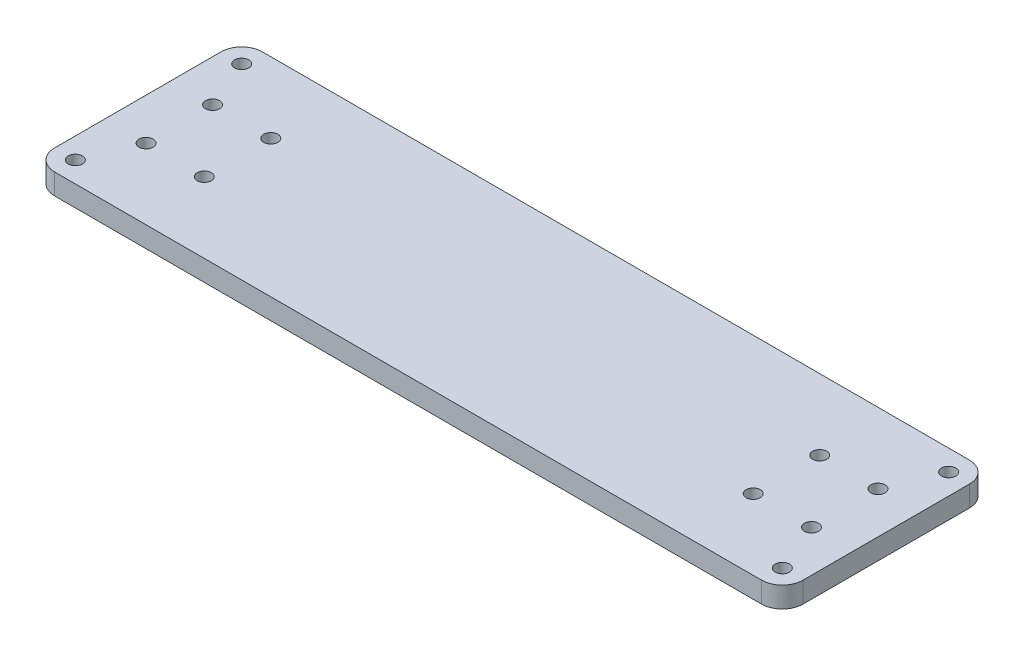
ISO-10303-21;
HEADER;
FILE_DESCRIPTION(('STEP AP214'),'2;1');
FILE_NAME('part.step','',(''),(''),'','','');
FILE_SCHEMA(('AUTOMOTIVE_DESIGN { 1 0 10303 214 1 1 1 1 }'));
ENDSEC;
DATA;
#1=APPLICATION_CONTEXT('core data for automotive mechanical design processes');
#2=APPLICATION_PROTOCOL_DEFINITION('international standard','automotive_design',2000,#1);
#3=PRODUCT_CONTEXT('',#1,'mechanical');
#4=PRODUCT('Part','Part','',(#3));
#5=PRODUCT_RELATED_PRODUCT_CATEGORY('part','',(#4));
#6=PRODUCT_DEFINITION_FORMATION('','',#4);
#7=PRODUCT_DEFINITION_CONTEXT('part definition',#1,'design');
#8=PRODUCT_DEFINITION('design','',#6,#7);
#9=PRODUCT_DEFINITION_SHAPE('','',#8);
#10=(LENGTH_UNIT() NAMED_UNIT(*) SI_UNIT(.MILLI.,.METRE.));
#11=(NAMED_UNIT(*) PLANE_ANGLE_UNIT() SI_UNIT($,.RADIAN.));
#12=(NAMED_UNIT(*) SI_UNIT($,.STERADIAN.) SOLID_ANGLE_UNIT());
#13=UNCERTAINTY_MEASURE_WITH_UNIT(LENGTH_MEASURE(1.E-05),#10,'distance_accuracy_value','');
#14=(GEOMETRIC_REPRESENTATION_CONTEXT(3) GLOBAL_UNCERTAINTY_ASSIGNED_CONTEXT((#13)) GLOBAL_UNIT_ASSIGNED_CONTEXT((#10,
#11,#12)) REPRESENTATION_CONTEXT('',''));
#15=CARTESIAN_POINT('',(0.,0.,0.));
#16=DIRECTION('',(0.,0.,1.));
#17=DIRECTION('',(1.,0.,0.));
#18=AXIS2_PLACEMENT_3D('',#15,#16,#17);
#19=CARTESIAN_POINT('',(-85.,5.,20.));
#20=DIRECTION('',(0.,1.,0.));
#21=DIRECTION('',(0.,0.,1.));
#22=AXIS2_PLACEMENT_3D('',#19,#20,#21);
#23=PLANE('',#22);
#24=CARTESIAN_POINT('',(80.,5.,8.));
#25=DIRECTION('',(0.,1.,0.));
#26=DIRECTION('',(0.,0.,-1.));
#27=AXIS2_PLACEMENT_3D('',#24,#25,#26);
#28=CIRCLE('',#27,1.7);
#29=CARTESIAN_POINT('',(80.,5.,6.3));
#30=VERTEX_POINT('',#29);
#31=EDGE_CURVE('E291',#30,#30,#28,.T.);
#32=ORIENTED_EDGE('',*,*,#31,.F.);
#33=EDGE_LOOP('',(#32));
#34=FACE_BOUND('',#33,.T.);
#35=CARTESIAN_POINT('',(66.,5.,8.));
#36=DIRECTION('',(0.,1.,0.));
#37=DIRECTION('',(0.,0.,1.));
#38=AXIS2_PLACEMENT_3D('',#35,#36,#37);
#39=CIRCLE('',#38,1.7);
#40=CARTESIAN_POINT('',(66.,5.,9.7));
#41=VERTEX_POINT('',#40);
#42=EDGE_CURVE('E275',#41,#41,#39,.T.);
#43=ORIENTED_EDGE('',*,*,#42,.F.);
#44=EDGE_LOOP('',(#43));
#45=FACE_BOUND('',#44,.T.);
#46=CARTESIAN_POINT('',(-66.,5.,8.));
#47=DIRECTION('',(0.,1.,0.));
#48=DIRECTION('',(0.,0.,-1.));
#49=AXIS2_PLACEMENT_3D('',#46,#47,#48);
#50=CIRCLE('',#49,1.7);
#51=CARTESIAN_POINT('',(-66.,5.,6.3));
#52=VERTEX_POINT('',#51);
#53=EDGE_CURVE('E259',#52,#52,#50,.T.);
#54=ORIENTED_EDGE('',*,*,#53,.F.);
#55=EDGE_LOOP('',(#54));
#56=FACE_BOUND('',#55,.T.);
#57=CARTESIAN_POINT('',(-80.,5.,-8.));
#58=DIRECTION('',(0.,1.,0.));
#59=DIRECTION('',(0.,0.,1.));
#60=AXIS2_PLACEMENT_3D('',#57,#58,#59);
#61=CIRCLE('',#60,1.70000000000001);
#62=CARTESIAN_POINT('',(-80.,5.,-6.29999999999999));
#63=VERTEX_POINT('',#62);
#64=EDGE_CURVE('E243',#63,#63,#61,.T.);
#65=ORIENTED_EDGE('',*,*,#64,.F.);
#66=EDGE_LOOP('',(#65));
#67=FACE_BOUND('',#66,.T.);
#68=CARTESIAN_POINT('',(85.,5.,-20.));
#69=DIRECTION('',(0.,1.,0.));
#70=DIRECTION('',(0.,0.,1.));
#71=AXIS2_PLACEMENT_3D('',#68,#69,#70);
#72=CIRCLE('',#71,1.7);
#73=CARTESIAN_POINT('',(85.,5.,-18.3));
#74=VERTEX_POINT('',#73);
#75=EDGE_CURVE('E227',#74,#74,#72,.T.);
#76=ORIENTED_EDGE('',*,*,#75,.F.);
#77=EDGE_LOOP('',(#76));
#78=FACE_BOUND('',#77,.T.);
#79=CARTESIAN_POINT('',(-85.,5.,-20.));
#80=DIRECTION('',(0.,1.,0.));
#81=DIRECTION('',(0.,0.,1.));
#82=AXIS2_PLACEMENT_3D('',#79,#80,#81);
#83=CIRCLE('',#82,1.7);
#84=CARTESIAN_POINT('',(-85.,5.,-18.3));
#85=VERTEX_POINT('',#84);
#86=EDGE_CURVE('E152',#85,#85,#83,.T.);
#87=ORIENTED_EDGE('',*,*,#86,.F.);
#88=EDGE_LOOP('',(#87));
#89=FACE_BOUND('',#88,.T.);
#90=CARTESIAN_POINT('',(-85.,5.,20.));
#91=DIRECTION('',(0.,1.,0.));
#92=DIRECTION('',(0.,0.,1.));
#93=AXIS2_PLACEMENT_3D('',#90,#91,#92);
#94=CIRCLE('',#93,5.);
#95=CARTESIAN_POINT('',(-90.,5.,20.));
#96=VERTEX_POINT('',#95);
#97=CARTESIAN_POINT('',(-85.,5.,25.));
#98=VERTEX_POINT('',#97);
#99=EDGE_CURVE('E170',#96,#98,#94,.T.);
#100=ORIENTED_EDGE('',*,*,#99,.T.);
#101=DIRECTION('',(1.,0.,0.));
#102=VECTOR('',#101,1.);
#103=CARTESIAN_POINT('',(-85.,5.,25.));
#104=LINE('',#103,#102);
#105=CARTESIAN_POINT('',(85.,5.,25.));
#106=VERTEX_POINT('',#105);
#107=EDGE_CURVE('E106',#98,#106,#104,.T.);
#108=ORIENTED_EDGE('',*,*,#107,.T.);
#109=CARTESIAN_POINT('',(85.,5.,20.));
#110=DIRECTION('',(0.,1.,0.));
#111=DIRECTION('',(0.,0.,1.));
#112=AXIS2_PLACEMENT_3D('',#109,#110,#111);
#113=CIRCLE('',#112,5.);
#114=CARTESIAN_POINT('',(90.,5.,20.));
#115=VERTEX_POINT('',#114);
#116=EDGE_CURVE('E191',#106,#115,#113,.T.);
#117=ORIENTED_EDGE('',*,*,#116,.T.);
#118=DIRECTION('',(0.,0.,-1.));
#119=VECTOR('',#118,1.);
#120=CARTESIAN_POINT('',(90.,5.,-20.));
#121=LINE('',#120,#119);
#122=CARTESIAN_POINT('',(90.,5.,-20.));
#123=VERTEX_POINT('',#122);
#124=EDGE_CURVE('E205',#115,#123,#121,.T.);
#125=ORIENTED_EDGE('',*,*,#124,.T.);
#126=CARTESIAN_POINT('',(85.,5.,-20.));
#127=DIRECTION('',(0.,1.,0.));
#128=DIRECTION('',(0.,0.,-1.));
#129=AXIS2_PLACEMENT_3D('',#126,#127,#128);
#130=CIRCLE('',#129,5.);
#131=CARTESIAN_POINT('',(85.,5.,-25.));
#132=VERTEX_POINT('',#131);
#133=EDGE_CURVE('E125',#123,#132,#130,.T.);
#134=ORIENTED_EDGE('',*,*,#133,.T.);
#135=DIRECTION('',(-1.,0.,0.));
#136=VECTOR('',#135,1.);
#137=CARTESIAN_POINT('',(-85.,5.,-25.));
#138=LINE('',#137,#136);
#139=CARTESIAN_POINT('',(-85.,5.,-25.));
#140=VERTEX_POINT('',#139);
#141=EDGE_CURVE('E119',#132,#140,#138,.T.);
#142=ORIENTED_EDGE('',*,*,#141,.T.);
#143=CARTESIAN_POINT('',(-85.,5.,-20.));
#144=DIRECTION('',(0.,1.,0.));
#145=DIRECTION('',(0.,0.,1.));
#146=AXIS2_PLACEMENT_3D('',#143,#144,#145);
#147=CIRCLE('',#146,5.);
#148=CARTESIAN_POINT('',(-90.,5.,-20.));
#149=VERTEX_POINT('',#148);
#150=EDGE_CURVE('E123',#140,#149,#147,.T.);
#151=ORIENTED_EDGE('',*,*,#150,.T.);
#152=DIRECTION('',(0.,0.,1.));
#153=VECTOR('',#152,1.);
#154=CARTESIAN_POINT('',(-90.,5.,-20.));
#155=LINE('',#154,#153);
#156=EDGE_CURVE('E63',#149,#96,#155,.T.);
#157=ORIENTED_EDGE('',*,*,#156,.T.);
#158=EDGE_LOOP('',(#100,#108,#117,#125,#134,#142,#151,#157));
#159=FACE_BOUND('',#158,.T.);
#160=CARTESIAN_POINT('',(-85.,5.,20.));
#161=DIRECTION('',(0.,1.,0.));
#162=DIRECTION('',(0.,0.,1.));
#163=AXIS2_PLACEMENT_3D('',#160,#161,#162);
#164=CIRCLE('',#163,1.7);
#165=CARTESIAN_POINT('',(-85.,5.,21.7));
#166=VERTEX_POINT('',#165);
#167=EDGE_CURVE('E219',#166,#166,#164,.T.);
#168=ORIENTED_EDGE('',*,*,#167,.F.);
#169=EDGE_LOOP('',(#168));
#170=FACE_BOUND('',#169,.T.);
#171=CARTESIAN_POINT('',(85.,5.,20.));
#172=DIRECTION('',(0.,1.,0.));
#173=DIRECTION('',(0.,0.,1.));
#174=AXIS2_PLACEMENT_3D('',#171,#172,#173);
#175=CIRCLE('',#174,1.7);
#176=CARTESIAN_POINT('',(85.,5.,21.7));
#177=VERTEX_POINT('',#176);
#178=EDGE_CURVE('E235',#177,#177,#175,.T.);
#179=ORIENTED_EDGE('',*,*,#178,.F.);
#180=EDGE_LOOP('',(#179));
#181=FACE_BOUND('',#180,.T.);
#182=CARTESIAN_POINT('',(-80.,5.,8.));
#183=DIRECTION('',(0.,1.,0.));
#184=DIRECTION('',(0.,0.,1.));
#185=AXIS2_PLACEMENT_3D('',#182,#183,#184);
#186=CIRCLE('',#185,1.7);
#187=CARTESIAN_POINT('',(-80.,5.,9.7));
#188=VERTEX_POINT('',#187);
#189=EDGE_CURVE('E251',#188,#188,#186,.T.);
#190=ORIENTED_EDGE('',*,*,#189,.F.);
#191=EDGE_LOOP('',(#190));
#192=FACE_BOUND('',#191,.T.);
#193=CARTESIAN_POINT('',(-66.,5.,-8.));
#194=DIRECTION('',(0.,1.,0.));
#195=DIRECTION('',(0.,0.,-1.));
#196=AXIS2_PLACEMENT_3D('',#193,#194,#195);
#197=CIRCLE('',#196,1.70000000000001);
#198=CARTESIAN_POINT('',(-66.,5.,-9.70000000000001));
#199=VERTEX_POINT('',#198);
#200=EDGE_CURVE('E267',#199,#199,#197,.T.);
#201=ORIENTED_EDGE('',*,*,#200,.F.);
#202=EDGE_LOOP('',(#201));
#203=FACE_BOUND('',#202,.T.);
#204=CARTESIAN_POINT('',(66.,5.,-8.));
#205=DIRECTION('',(0.,1.,0.));
#206=DIRECTION('',(0.,0.,1.));
#207=AXIS2_PLACEMENT_3D('',#204,#205,#206);
#208=CIRCLE('',#207,1.70000000000001);
#209=CARTESIAN_POINT('',(66.,5.,-6.29999999999999));
#210=VERTEX_POINT('',#209);
#211=EDGE_CURVE('E283',#210,#210,#208,.T.);
#212=ORIENTED_EDGE('',*,*,#211,.F.);
#213=EDGE_LOOP('',(#212));
#214=FACE_BOUND('',#213,.T.);
#215=CARTESIAN_POINT('',(80.,5.,-8.));
#216=DIRECTION('',(0.,1.,0.));
#217=DIRECTION('',(0.,0.,-1.));
#218=AXIS2_PLACEMENT_3D('',#215,#216,#217);
#219=CIRCLE('',#218,1.70000000000001);
#220=CARTESIAN_POINT('',(80.,5.,-9.70000000000001));
#221=VERTEX_POINT('',#220);
#222=EDGE_CURVE('E299',#221,#221,#219,.T.);
#223=ORIENTED_EDGE('',*,*,#222,.F.);
#224=EDGE_LOOP('',(#223));
#225=FACE_BOUND('',#224,.T.);
#226=ADVANCED_FACE('F45',(#34,#45,#56,#67,#78,#89,#159,#170,#181,#192,#203,#214,#225),#23,.T.);
#227=CARTESIAN_POINT('',(-85.,0.,20.));
#228=DIRECTION('',(0.,1.,0.));
#229=DIRECTION('',(0.,0.,1.));
#230=AXIS2_PLACEMENT_3D('',#227,#228,#229);
#231=PLANE('',#230);
#232=CARTESIAN_POINT('',(-85.,0.,20.));
#233=DIRECTION('',(0.,1.,0.));
#234=DIRECTION('',(0.,0.,1.));
#235=AXIS2_PLACEMENT_3D('',#232,#233,#234);
#236=CIRCLE('',#235,5.);
#237=CARTESIAN_POINT('',(-90.,0.,20.));
#238=VERTEX_POINT('',#237);
#239=CARTESIAN_POINT('',(-85.,0.,25.));
#240=VERTEX_POINT('',#239);
#241=EDGE_CURVE('E147',#238,#240,#236,.T.);
#242=ORIENTED_EDGE('',*,*,#241,.F.);
#243=DIRECTION('',(0.,0.,1.));
#244=VECTOR('',#243,1.);
#245=CARTESIAN_POINT('',(-90.,0.,-20.));
#246=LINE('',#245,#244);
#247=CARTESIAN_POINT('',(-90.,0.,-20.));
#248=VERTEX_POINT('',#247);
#249=EDGE_CURVE('E98',#248,#238,#246,.T.);
#250=ORIENTED_EDGE('',*,*,#249,.F.);
#251=CARTESIAN_POINT('',(-85.,0.,-20.));
#252=DIRECTION('',(0.,1.,0.));
#253=DIRECTION('',(0.,0.,1.));
#254=AXIS2_PLACEMENT_3D('',#251,#252,#253);
#255=CIRCLE('',#254,5.);
#256=CARTESIAN_POINT('',(-85.,0.,-25.));
#257=VERTEX_POINT('',#256);
#258=EDGE_CURVE('E92',#257,#248,#255,.T.);
#259=ORIENTED_EDGE('',*,*,#258,.F.);
#260=DIRECTION('',(-1.,0.,0.));
#261=VECTOR('',#260,1.);
#262=CARTESIAN_POINT('',(-85.,0.,-25.));
#263=LINE('',#262,#261);
#264=CARTESIAN_POINT('',(85.,0.,-25.));
#265=VERTEX_POINT('',#264);
#266=EDGE_CURVE('E134',#265,#257,#263,.T.);
#267=ORIENTED_EDGE('',*,*,#266,.F.);
#268=CARTESIAN_POINT('',(85.,0.,-20.));
#269=DIRECTION('',(0.,1.,0.));
#270=DIRECTION('',(0.,0.,-1.));
#271=AXIS2_PLACEMENT_3D('',#268,#269,#270);
#272=CIRCLE('',#271,5.);
#273=CARTESIAN_POINT('',(90.,0.,-20.));
#274=VERTEX_POINT('',#273);
#275=EDGE_CURVE('E161',#274,#265,#272,.T.);
#276=ORIENTED_EDGE('',*,*,#275,.F.);
#277=DIRECTION('',(0.,0.,-1.));
#278=VECTOR('',#277,1.);
#279=CARTESIAN_POINT('',(90.,0.,-20.));
#280=LINE('',#279,#278);
#281=CARTESIAN_POINT('',(90.,0.,20.));
#282=VERTEX_POINT('',#281);
#283=EDGE_CURVE('E158',#282,#274,#280,.T.);
#284=ORIENTED_EDGE('',*,*,#283,.F.);
#285=CARTESIAN_POINT('',(85.,0.,20.));
#286=DIRECTION('',(0.,1.,0.));
#287=DIRECTION('',(0.,0.,1.));
#288=AXIS2_PLACEMENT_3D('',#285,#286,#287);
#289=CIRCLE('',#288,5.);
#290=CARTESIAN_POINT('',(85.,0.,25.));
#291=VERTEX_POINT('',#290);
#292=EDGE_CURVE('E155',#291,#282,#289,.T.);
#293=ORIENTED_EDGE('',*,*,#292,.F.);
#294=DIRECTION('',(1.,0.,0.));
#295=VECTOR('',#294,1.);
#296=CARTESIAN_POINT('',(-85.,0.,25.));
#297=LINE('',#296,#295);
#298=EDGE_CURVE('E151',#240,#291,#297,.T.);
#299=ORIENTED_EDGE('',*,*,#298,.F.);
#300=EDGE_LOOP('',(#242,#250,#259,#267,#276,#284,#293,#299));
#301=FACE_BOUND('',#300,.T.);
#302=CARTESIAN_POINT('',(-85.,0.,-20.));
#303=DIRECTION('',(0.,1.,0.));
#304=DIRECTION('',(0.,0.,1.));
#305=AXIS2_PLACEMENT_3D('',#302,#303,#304);
#306=CIRCLE('',#305,1.7);
#307=CARTESIAN_POINT('',(-85.,0.,-18.3));
#308=VERTEX_POINT('',#307);
#309=EDGE_CURVE('E215',#308,#308,#306,.T.);
#310=ORIENTED_EDGE('',*,*,#309,.T.);
#311=EDGE_LOOP('',(#310));
#312=FACE_BOUND('',#311,.T.);
#313=CARTESIAN_POINT('',(-85.,0.,20.));
#314=DIRECTION('',(0.,1.,0.));
#315=DIRECTION('',(0.,0.,1.));
#316=AXIS2_PLACEMENT_3D('',#313,#314,#315);
#317=CIRCLE('',#316,1.7);
#318=CARTESIAN_POINT('',(-85.,0.,21.7));
#319=VERTEX_POINT('',#318);
#320=EDGE_CURVE('E223',#319,#319,#317,.T.);
#321=ORIENTED_EDGE('',*,*,#320,.T.);
#322=EDGE_LOOP('',(#321));
#323=FACE_BOUND('',#322,.T.);
#324=CARTESIAN_POINT('',(85.,0.,-20.));
#325=DIRECTION('',(0.,1.,0.));
#326=DIRECTION('',(0.,0.,1.));
#327=AXIS2_PLACEMENT_3D('',#324,#325,#326);
#328=CIRCLE('',#327,1.7);
#329=CARTESIAN_POINT('',(85.,0.,-18.3));
#330=VERTEX_POINT('',#329);
#331=EDGE_CURVE('E231',#330,#330,#328,.T.);
#332=ORIENTED_EDGE('',*,*,#331,.T.);
#333=EDGE_LOOP('',(#332));
#334=FACE_BOUND('',#333,.T.);
#335=CARTESIAN_POINT('',(85.,0.,20.));
#336=DIRECTION('',(0.,1.,0.));
#337=DIRECTION('',(0.,0.,1.));
#338=AXIS2_PLACEMENT_3D('',#335,#336,#337);
#339=CIRCLE('',#338,1.7);
#340=CARTESIAN_POINT('',(85.,0.,21.7));
#341=VERTEX_POINT('',#340);
#342=EDGE_CURVE('E239',#341,#341,#339,.T.);
#343=ORIENTED_EDGE('',*,*,#342,.T.);
#344=EDGE_LOOP('',(#343));
#345=FACE_BOUND('',#344,.T.);
#346=CARTESIAN_POINT('',(-80.,0.,-8.));
#347=DIRECTION('',(0.,1.,0.));
#348=DIRECTION('',(0.,0.,1.));
#349=AXIS2_PLACEMENT_3D('',#346,#347,#348);
#350=CIRCLE('',#349,1.70000000000001);
#351=CARTESIAN_POINT('',(-80.,0.,-6.29999999999999));
#352=VERTEX_POINT('',#351);
#353=EDGE_CURVE('E247',#352,#352,#350,.T.);
#354=ORIENTED_EDGE('',*,*,#353,.T.);
#355=EDGE_LOOP('',(#354));
#356=FACE_BOUND('',#355,.T.);
#357=CARTESIAN_POINT('',(-80.,0.,8.));
#358=DIRECTION('',(0.,1.,0.));
#359=DIRECTION('',(0.,0.,1.));
#360=AXIS2_PLACEMENT_3D('',#357,#358,#359);
#361=CIRCLE('',#360,1.7);
#362=CARTESIAN_POINT('',(-80.,0.,9.7));
#363=VERTEX_POINT('',#362);
#364=EDGE_CURVE('E255',#363,#363,#361,.T.);
#365=ORIENTED_EDGE('',*,*,#364,.T.);
#366=EDGE_LOOP('',(#365));
#367=FACE_BOUND('',#366,.T.);
#368=CARTESIAN_POINT('',(-66.,0.,8.));
#369=DIRECTION('',(0.,1.,0.));
#370=DIRECTION('',(0.,0.,-1.));
#371=AXIS2_PLACEMENT_3D('',#368,#369,#370);
#372=CIRCLE('',#371,1.7);
#373=CARTESIAN_POINT('',(-66.,0.,6.3));
#374=VERTEX_POINT('',#373);
#375=EDGE_CURVE('E263',#374,#374,#372,.T.);
#376=ORIENTED_EDGE('',*,*,#375,.T.);
#377=EDGE_LOOP('',(#376));
#378=FACE_BOUND('',#377,.T.);
#379=CARTESIAN_POINT('',(-66.,0.,-8.));
#380=DIRECTION('',(0.,1.,0.));
#381=DIRECTION('',(0.,0.,-1.));
#382=AXIS2_PLACEMENT_3D('',#379,#380,#381);
#383=CIRCLE('',#382,1.70000000000001);
#384=CARTESIAN_POINT('',(-66.,0.,-9.70000000000001));
#385=VERTEX_POINT('',#384);
#386=EDGE_CURVE('E271',#385,#385,#383,.T.);
#387=ORIENTED_EDGE('',*,*,#386,.T.);
#388=EDGE_LOOP('',(#387));
#389=FACE_BOUND('',#388,.T.);
#390=CARTESIAN_POINT('',(66.,0.,8.));
#391=DIRECTION('',(0.,1.,0.));
#392=DIRECTION('',(0.,0.,1.));
#393=AXIS2_PLACEMENT_3D('',#390,#391,#392);
#394=CIRCLE('',#393,1.7);
#395=CARTESIAN_POINT('',(66.,0.,9.7));
#396=VERTEX_POINT('',#395);
#397=EDGE_CURVE('E279',#396,#396,#394,.T.);
#398=ORIENTED_EDGE('',*,*,#397,.T.);
#399=EDGE_LOOP('',(#398));
#400=FACE_BOUND('',#399,.T.);
#401=CARTESIAN_POINT('',(66.,0.,-8.));
#402=DIRECTION('',(0.,1.,0.));
#403=DIRECTION('',(0.,0.,1.));
#404=AXIS2_PLACEMENT_3D('',#401,#402,#403);
#405=CIRCLE('',#404,1.70000000000001);
#406=CARTESIAN_POINT('',(66.,0.,-6.29999999999999));
#407=VERTEX_POINT('',#406);
#408=EDGE_CURVE('E287',#407,#407,#405,.T.);
#409=ORIENTED_EDGE('',*,*,#408,.T.);
#410=EDGE_LOOP('',(#409));
#411=FACE_BOUND('',#410,.T.);
#412=CARTESIAN_POINT('',(80.,0.,8.));
#413=DIRECTION('',(0.,1.,0.));
#414=DIRECTION('',(0.,0.,-1.));
#415=AXIS2_PLACEMENT_3D('',#412,#413,#414);
#416=CIRCLE('',#415,1.7);
#417=CARTESIAN_POINT('',(80.,0.,6.3));
#418=VERTEX_POINT('',#417);
#419=EDGE_CURVE('E295',#418,#418,#416,.T.);
#420=ORIENTED_EDGE('',*,*,#419,.T.);
#421=EDGE_LOOP('',(#420));
#422=FACE_BOUND('',#421,.T.);
#423=CARTESIAN_POINT('',(80.,0.,-8.));
#424=DIRECTION('',(0.,1.,0.));
#425=DIRECTION('',(0.,0.,-1.));
#426=AXIS2_PLACEMENT_3D('',#423,#424,#425);
#427=CIRCLE('',#426,1.70000000000001);
#428=CARTESIAN_POINT('',(80.,0.,-9.70000000000001));
#429=VERTEX_POINT('',#428);
#430=EDGE_CURVE('E303',#429,#429,#427,.T.);
#431=ORIENTED_EDGE('',*,*,#430,.T.);
#432=EDGE_LOOP('',(#431));
#433=FACE_BOUND('',#432,.T.);
#434=ADVANCED_FACE('F195',(#301,#312,#323,#334,#345,#356,#367,#378,#389,#400,#411,#422,#433),
#231,.F.);
#435=CARTESIAN_POINT('',(-85.,5.,20.));
#436=DIRECTION('',(0.,-1.,0.));
#437=DIRECTION('',(0.,0.,-1.));
#438=AXIS2_PLACEMENT_3D('',#435,#436,#437);
#439=CYLINDRICAL_SURFACE('',#438,5.);
#440=ORIENTED_EDGE('',*,*,#241,.T.);
#441=DIRECTION('',(0.,-1.,0.));
#442=VECTOR('',#441,1.);
#443=CARTESIAN_POINT('',(-85.,5.,25.));
#444=LINE('',#443,#442);
#445=EDGE_CURVE('E11',#98,#240,#444,.T.);
#446=ORIENTED_EDGE('',*,*,#445,.F.);
#447=ORIENTED_EDGE('',*,*,#99,.F.);
#448=DIRECTION('',(0.,-1.,0.));
#449=VECTOR('',#448,1.);
#450=CARTESIAN_POINT('',(-90.,5.,20.));
#451=LINE('',#450,#449);
#452=EDGE_CURVE('E143',#96,#238,#451,.T.);
#453=ORIENTED_EDGE('',*,*,#452,.T.);
#454=EDGE_LOOP('',(#440,#446,#447,#453));
#455=FACE_BOUND('',#454,.T.);
#456=ADVANCED_FACE('F47',(#455),#439,.T.);
#457=CARTESIAN_POINT('',(-85.,5.,25.));
#458=DIRECTION('',(0.,0.,-1.));
#459=DIRECTION('',(-1.,0.,0.));
#460=AXIS2_PLACEMENT_3D('',#457,#458,#459);
#461=PLANE('',#460);
#462=ORIENTED_EDGE('',*,*,#298,.T.);
#463=DIRECTION('',(0.,-1.,0.));
#464=VECTOR('',#463,1.);
#465=CARTESIAN_POINT('',(85.,5.,25.));
#466=LINE('',#465,#464);
#467=EDGE_CURVE('E55',#106,#291,#466,.T.);
#468=ORIENTED_EDGE('',*,*,#467,.F.);
#469=ORIENTED_EDGE('',*,*,#107,.F.);
#470=ORIENTED_EDGE('',*,*,#445,.T.);
#471=EDGE_LOOP('',(#462,#468,#469,#470));
#472=FACE_BOUND('',#471,.T.);
#473=ADVANCED_FACE('F339',(#472),#461,.F.);
#474=CARTESIAN_POINT('',(85.,5.,20.));
#475=DIRECTION('',(0.,-1.,0.));
#476=DIRECTION('',(0.,0.,-1.));
#477=AXIS2_PLACEMENT_3D('',#474,#475,#476);
#478=CYLINDRICAL_SURFACE('',#477,5.);
#479=ORIENTED_EDGE('',*,*,#292,.T.);
#480=DIRECTION('',(0.,-1.,0.));
#481=VECTOR('',#480,1.);
#482=CARTESIAN_POINT('',(90.,5.,20.));
#483=LINE('',#482,#481);
#484=EDGE_CURVE('E181',#115,#282,#483,.T.);
#485=ORIENTED_EDGE('',*,*,#484,.F.);
#486=ORIENTED_EDGE('',*,*,#116,.F.);
#487=ORIENTED_EDGE('',*,*,#467,.T.);
#488=EDGE_LOOP('',(#479,#485,#486,#487));
#489=FACE_BOUND('',#488,.T.);
#490=ADVANCED_FACE('F189',(#489),#478,.T.);
#491=CARTESIAN_POINT('',(90.,5.,-20.));
#492=DIRECTION('',(-1.,0.,0.));
#493=DIRECTION('',(0.,0.,1.));
#494=AXIS2_PLACEMENT_3D('',#491,#492,#493);
#495=PLANE('',#494);
#496=ORIENTED_EDGE('',*,*,#283,.T.);
#497=DIRECTION('',(0.,-1.,0.));
#498=VECTOR('',#497,1.);
#499=CARTESIAN_POINT('',(90.,5.,-20.));
#500=LINE('',#499,#498);
#501=EDGE_CURVE('E177',#123,#274,#500,.T.);
#502=ORIENTED_EDGE('',*,*,#501,.F.);
#503=ORIENTED_EDGE('',*,*,#124,.F.);
#504=ORIENTED_EDGE('',*,*,#484,.T.);
#505=EDGE_LOOP('',(#496,#502,#503,#504));
#506=FACE_BOUND('',#505,.T.);
#507=ADVANCED_FACE('F200',(#506),#495,.F.);
#508=CARTESIAN_POINT('',(85.,5.,-20.));
#509=DIRECTION('',(0.,-1.,0.));
#510=DIRECTION('',(0.,0.,-1.));
#511=AXIS2_PLACEMENT_3D('',#508,#509,#510);
#512=CYLINDRICAL_SURFACE('',#511,5.);
#513=ORIENTED_EDGE('',*,*,#275,.T.);
#514=DIRECTION('',(0.,-1.,0.));
#515=VECTOR('',#514,1.);
#516=CARTESIAN_POINT('',(85.,5.,-25.));
#517=LINE('',#516,#515);
#518=EDGE_CURVE('E136',#132,#265,#517,.T.);
#519=ORIENTED_EDGE('',*,*,#518,.F.);
#520=ORIENTED_EDGE('',*,*,#133,.F.);
#521=ORIENTED_EDGE('',*,*,#501,.T.);
#522=EDGE_LOOP('',(#513,#519,#520,#521));
#523=FACE_BOUND('',#522,.T.);
#524=ADVANCED_FACE('F203',(#523),#512,.T.);
#525=CARTESIAN_POINT('',(-85.,5.,-25.));
#526=DIRECTION('',(0.,0.,1.));
#527=DIRECTION('',(1.,0.,0.));
#528=AXIS2_PLACEMENT_3D('',#525,#526,#527);
#529=PLANE('',#528);
#530=ORIENTED_EDGE('',*,*,#266,.T.);
#531=DIRECTION('',(0.,-1.,0.));
#532=VECTOR('',#531,1.);
#533=CARTESIAN_POINT('',(-85.,5.,-25.));
#534=LINE('',#533,#532);
#535=EDGE_CURVE('E131',#140,#257,#534,.T.);
#536=ORIENTED_EDGE('',*,*,#535,.F.);
#537=ORIENTED_EDGE('',*,*,#141,.F.);
#538=ORIENTED_EDGE('',*,*,#518,.T.);
#539=EDGE_LOOP('',(#530,#536,#537,#538));
#540=FACE_BOUND('',#539,.T.);
#541=ADVANCED_FACE('F132',(#540),#529,.F.);
#542=CARTESIAN_POINT('',(-85.,5.,-20.));
#543=DIRECTION('',(0.,-1.,0.));
#544=DIRECTION('',(0.,0.,-1.));
#545=AXIS2_PLACEMENT_3D('',#542,#543,#544);
#546=CYLINDRICAL_SURFACE('',#545,5.);
#547=ORIENTED_EDGE('',*,*,#258,.T.);
#548=DIRECTION('',(0.,-1.,0.));
#549=VECTOR('',#548,1.);
#550=CARTESIAN_POINT('',(-90.,5.,-20.));
#551=LINE('',#550,#549);
#552=EDGE_CURVE('E137',#149,#248,#551,.T.);
#553=ORIENTED_EDGE('',*,*,#552,.F.);
#554=ORIENTED_EDGE('',*,*,#150,.F.);
#555=ORIENTED_EDGE('',*,*,#535,.T.);
#556=EDGE_LOOP('',(#547,#553,#554,#555));
#557=FACE_BOUND('',#556,.T.);
#558=ADVANCED_FACE('F139',(#557),#546,.T.);
#559=CARTESIAN_POINT('',(-90.,5.,-20.));
#560=DIRECTION('',(1.,0.,0.));
#561=DIRECTION('',(0.,0.,-1.));
#562=AXIS2_PLACEMENT_3D('',#559,#560,#561);
#563=PLANE('',#562);
#564=ORIENTED_EDGE('',*,*,#249,.T.);
#565=ORIENTED_EDGE('',*,*,#452,.F.);
#566=ORIENTED_EDGE('',*,*,#156,.F.);
#567=ORIENTED_EDGE('',*,*,#552,.T.);
#568=EDGE_LOOP('',(#564,#565,#566,#567));
#569=FACE_BOUND('',#568,.T.);
#570=ADVANCED_FACE('F327',(#569),#563,.F.);
#571=CARTESIAN_POINT('',(-85.,5.,-20.));
#572=DIRECTION('',(0.,-1.,0.));
#573=DIRECTION('',(0.,0.,-1.));
#574=AXIS2_PLACEMENT_3D('',#571,#572,#573);
#575=CYLINDRICAL_SURFACE('',#574,1.7);
#576=ORIENTED_EDGE('',*,*,#86,.T.);
#577=EDGE_LOOP('',(#576));
#578=FACE_BOUND('',#577,.T.);
#579=ORIENTED_EDGE('',*,*,#309,.F.);
#580=EDGE_LOOP('',(#579));
#581=FACE_BOUND('',#580,.T.);
#582=ADVANCED_FACE('F324',(#578,#581),#575,.F.);
#583=CARTESIAN_POINT('',(-85.,5.,20.));
#584=DIRECTION('',(0.,-1.,0.));
#585=DIRECTION('',(0.,0.,-1.));
#586=AXIS2_PLACEMENT_3D('',#583,#584,#585);
#587=CYLINDRICAL_SURFACE('',#586,1.7);
#588=ORIENTED_EDGE('',*,*,#167,.T.);
#589=EDGE_LOOP('',(#588));
#590=FACE_BOUND('',#589,.T.);
#591=ORIENTED_EDGE('',*,*,#320,.F.);
#592=EDGE_LOOP('',(#591));
#593=FACE_BOUND('',#592,.T.);
#594=ADVANCED_FACE('F402',(#590,#593),#587,.F.);
#595=CARTESIAN_POINT('',(85.,5.,-20.));
#596=DIRECTION('',(0.,-1.,0.));
#597=DIRECTION('',(0.,0.,-1.));
#598=AXIS2_PLACEMENT_3D('',#595,#596,#597);
#599=CYLINDRICAL_SURFACE('',#598,1.7);
#600=ORIENTED_EDGE('',*,*,#75,.T.);
#601=EDGE_LOOP('',(#600));
#602=FACE_BOUND('',#601,.T.);
#603=ORIENTED_EDGE('',*,*,#331,.F.);
#604=EDGE_LOOP('',(#603));
#605=FACE_BOUND('',#604,.T.);
#606=ADVANCED_FACE('F410',(#602,#605),#599,.F.);
#607=CARTESIAN_POINT('',(85.,5.,20.));
#608=DIRECTION('',(0.,-1.,0.));
#609=DIRECTION('',(0.,0.,-1.));
#610=AXIS2_PLACEMENT_3D('',#607,#608,#609);
#611=CYLINDRICAL_SURFACE('',#610,1.7);
#612=ORIENTED_EDGE('',*,*,#178,.T.);
#613=EDGE_LOOP('',(#612));
#614=FACE_BOUND('',#613,.T.);
#615=ORIENTED_EDGE('',*,*,#342,.F.);
#616=EDGE_LOOP('',(#615));
#617=FACE_BOUND('',#616,.T.);
#618=ADVANCED_FACE('F418',(#614,#617),#611,.F.);
#619=CARTESIAN_POINT('',(-80.,5.,-8.));
#620=DIRECTION('',(0.,-1.,0.));
#621=DIRECTION('',(0.,0.,-1.));
#622=AXIS2_PLACEMENT_3D('',#619,#620,#621);
#623=CYLINDRICAL_SURFACE('',#622,1.70000000000001);
#624=ORIENTED_EDGE('',*,*,#64,.T.);
#625=EDGE_LOOP('',(#624));
#626=FACE_BOUND('',#625,.T.);
#627=ORIENTED_EDGE('',*,*,#353,.F.);
#628=EDGE_LOOP('',(#627));
#629=FACE_BOUND('',#628,.T.);
#630=ADVANCED_FACE('F427',(#626,#629),#623,.F.);
#631=CARTESIAN_POINT('',(-80.,5.,8.));
#632=DIRECTION('',(0.,-1.,0.));
#633=DIRECTION('',(0.,0.,-1.));
#634=AXIS2_PLACEMENT_3D('',#631,#632,#633);
#635=CYLINDRICAL_SURFACE('',#634,1.7);
#636=ORIENTED_EDGE('',*,*,#189,.T.);
#637=EDGE_LOOP('',(#636));
#638=FACE_BOUND('',#637,.T.);
#639=ORIENTED_EDGE('',*,*,#364,.F.);
#640=EDGE_LOOP('',(#639));
#641=FACE_BOUND('',#640,.T.);
#642=ADVANCED_FACE('F436',(#638,#641),#635,.F.);
#643=CARTESIAN_POINT('',(-66.,5.,8.));
#644=DIRECTION('',(0.,-1.,0.));
#645=DIRECTION('',(0.,0.,-1.));
#646=AXIS2_PLACEMENT_3D('',#643,#644,#645);
#647=CYLINDRICAL_SURFACE('',#646,1.7);
#648=ORIENTED_EDGE('',*,*,#53,.T.);
#649=EDGE_LOOP('',(#648));
#650=FACE_BOUND('',#649,.T.);
#651=ORIENTED_EDGE('',*,*,#375,.F.);
#652=EDGE_LOOP('',(#651));
#653=FACE_BOUND('',#652,.T.);
#654=ADVANCED_FACE('F445',(#650,#653),#647,.F.);
#655=CARTESIAN_POINT('',(-66.,5.,-8.));
#656=DIRECTION('',(0.,-1.,0.));
#657=DIRECTION('',(0.,0.,-1.));
#658=AXIS2_PLACEMENT_3D('',#655,#656,#657);
#659=CYLINDRICAL_SURFACE('',#658,1.70000000000001);
#660=ORIENTED_EDGE('',*,*,#200,.T.);
#661=EDGE_LOOP('',(#660));
#662=FACE_BOUND('',#661,.T.);
#663=ORIENTED_EDGE('',*,*,#386,.F.);
#664=EDGE_LOOP('',(#663));
#665=FACE_BOUND('',#664,.T.);
#666=ADVANCED_FACE('F454',(#662,#665),#659,.F.);
#667=CARTESIAN_POINT('',(66.,5.,8.));
#668=DIRECTION('',(0.,-1.,0.));
#669=DIRECTION('',(0.,0.,-1.));
#670=AXIS2_PLACEMENT_3D('',#667,#668,#669);
#671=CYLINDRICAL_SURFACE('',#670,1.7);
#672=ORIENTED_EDGE('',*,*,#42,.T.);
#673=EDGE_LOOP('',(#672));
#674=FACE_BOUND('',#673,.T.);
#675=ORIENTED_EDGE('',*,*,#397,.F.);
#676=EDGE_LOOP('',(#675));
#677=FACE_BOUND('',#676,.T.);
#678=ADVANCED_FACE('F463',(#674,#677),#671,.F.);
#679=CARTESIAN_POINT('',(66.,5.,-8.));
#680=DIRECTION('',(0.,-1.,0.));
#681=DIRECTION('',(0.,0.,-1.));
#682=AXIS2_PLACEMENT_3D('',#679,#680,#681);
#683=CYLINDRICAL_SURFACE('',#682,1.70000000000001);
#684=ORIENTED_EDGE('',*,*,#211,.T.);
#685=EDGE_LOOP('',(#684));
#686=FACE_BOUND('',#685,.T.);
#687=ORIENTED_EDGE('',*,*,#408,.F.);
#688=EDGE_LOOP('',(#687));
#689=FACE_BOUND('',#688,.T.);
#690=ADVANCED_FACE('F472',(#686,#689),#683,.F.);
#691=CARTESIAN_POINT('',(80.,5.,8.));
#692=DIRECTION('',(0.,-1.,0.));
#693=DIRECTION('',(0.,0.,-1.));
#694=AXIS2_PLACEMENT_3D('',#691,#692,#693);
#695=CYLINDRICAL_SURFACE('',#694,1.7);
#696=ORIENTED_EDGE('',*,*,#31,.T.);
#697=EDGE_LOOP('',(#696));
#698=FACE_BOUND('',#697,.T.);
#699=ORIENTED_EDGE('',*,*,#419,.F.);
#700=EDGE_LOOP('',(#699));
#701=FACE_BOUND('',#700,.T.);
#702=ADVANCED_FACE('F481',(#698,#701),#695,.F.);
#703=CARTESIAN_POINT('',(80.,5.,-8.));
#704=DIRECTION('',(0.,-1.,0.));
#705=DIRECTION('',(0.,0.,-1.));
#706=AXIS2_PLACEMENT_3D('',#703,#704,#705);
#707=CYLINDRICAL_SURFACE('',#706,1.70000000000001);
#708=ORIENTED_EDGE('',*,*,#222,.T.);
#709=EDGE_LOOP('',(#708));
#710=FACE_BOUND('',#709,.T.);
#711=ORIENTED_EDGE('',*,*,#430,.F.);
#712=EDGE_LOOP('',(#711));
#713=FACE_BOUND('',#712,.T.);
#714=ADVANCED_FACE('F311',(#710,#713),#707,.F.);
#715=CLOSED_SHELL('',(#226,#434,#456,#473,#490,#507,#524,#541,#558,#570,#582,#594,#606,#618,
#630,#642,#654,#666,#678,#690,#702,#714));
#716=MANIFOLD_SOLID_BREP('B2',#715);
#717=ADVANCED_BREP_SHAPE_REPRESENTATION('',(#18,#716),#14);
#718=SHAPE_DEFINITION_REPRESENTATION(#9,#717);
ENDSEC;
END-ISO-10303-21;
